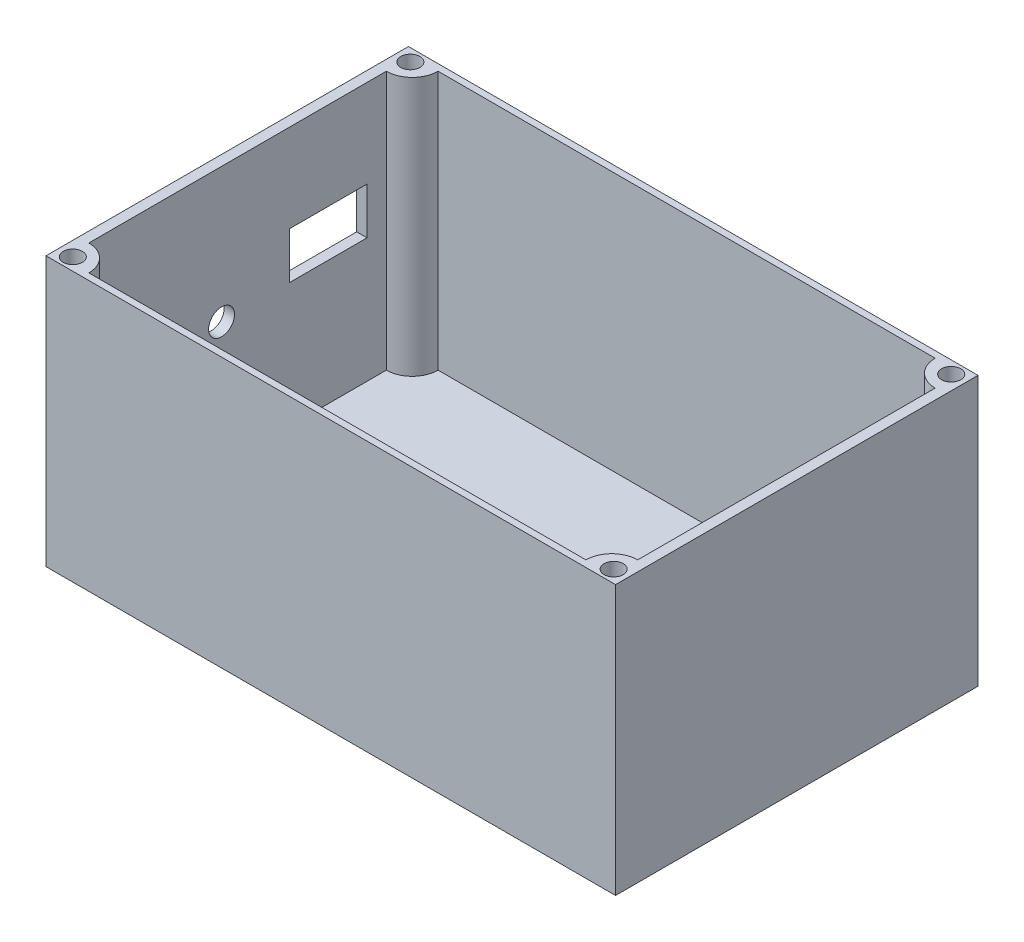
ISO-10303-21;
HEADER;
FILE_DESCRIPTION(('STEP AP214'),'2;1');
FILE_NAME('part.step','',(''),(''),'','','');
FILE_SCHEMA(('AUTOMOTIVE_DESIGN { 1 0 10303 214 1 1 1 1 }'));
ENDSEC;
DATA;
#1=APPLICATION_CONTEXT('core data for automotive mechanical design processes');
#2=APPLICATION_PROTOCOL_DEFINITION('international standard','automotive_design',2000,#1);
#3=PRODUCT_CONTEXT('',#1,'mechanical');
#4=PRODUCT('Part','Part','',(#3));
#5=PRODUCT_RELATED_PRODUCT_CATEGORY('part','',(#4));
#6=PRODUCT_DEFINITION_FORMATION('','',#4);
#7=PRODUCT_DEFINITION_CONTEXT('part definition',#1,'design');
#8=PRODUCT_DEFINITION('design','',#6,#7);
#9=PRODUCT_DEFINITION_SHAPE('','',#8);
#10=(LENGTH_UNIT() NAMED_UNIT(*) SI_UNIT(.MILLI.,.METRE.));
#11=(NAMED_UNIT(*) PLANE_ANGLE_UNIT() SI_UNIT($,.RADIAN.));
#12=(NAMED_UNIT(*) SI_UNIT($,.STERADIAN.) SOLID_ANGLE_UNIT());
#13=UNCERTAINTY_MEASURE_WITH_UNIT(LENGTH_MEASURE(1.E-05),#10,'distance_accuracy_value','');
#14=(GEOMETRIC_REPRESENTATION_CONTEXT(3) GLOBAL_UNCERTAINTY_ASSIGNED_CONTEXT((#13)) GLOBAL_UNIT_ASSIGNED_CONTEXT((#10,
#11,#12)) REPRESENTATION_CONTEXT('',''));
#15=CARTESIAN_POINT('',(0.,0.,0.));
#16=DIRECTION('',(0.,0.,1.));
#17=DIRECTION('',(1.,0.,0.));
#18=AXIS2_PLACEMENT_3D('',#15,#16,#17);
#19=CARTESIAN_POINT('',(55.,2.,35.));
#20=DIRECTION('',(-1.,0.,0.));
#21=DIRECTION('',(0.,0.,1.));
#22=AXIS2_PLACEMENT_3D('',#19,#20,#21);
#23=PLANE('',#22);
#24=DIRECTION('',(0.,0.,-1.));
#25=VECTOR('',#24,1.);
#26=CARTESIAN_POINT('',(55.,0.,35.));
#27=LINE('',#26,#25);
#28=CARTESIAN_POINT('',(55.,0.,35.));
#29=VERTEX_POINT('',#28);
#30=CARTESIAN_POINT('',(55.,0.,-35.));
#31=VERTEX_POINT('',#30);
#32=EDGE_CURVE('E251',#29,#31,#27,.T.);
#33=ORIENTED_EDGE('',*,*,#32,.T.);
#34=DIRECTION('',(0.,-1.,0.));
#35=VECTOR('',#34,1.);
#36=CARTESIAN_POINT('',(55.,2.,-35.));
#37=LINE('',#36,#35);
#38=CARTESIAN_POINT('',(55.,52.,-35.));
#39=VERTEX_POINT('',#38);
#40=EDGE_CURVE('E269',#39,#31,#37,.T.);
#41=ORIENTED_EDGE('',*,*,#40,.F.);
#42=DIRECTION('',(0.,0.,-1.));
#43=VECTOR('',#42,1.);
#44=CARTESIAN_POINT('',(55.,52.,35.));
#45=LINE('',#44,#43);
#46=CARTESIAN_POINT('',(55.,52.,35.));
#47=VERTEX_POINT('',#46);
#48=EDGE_CURVE('E239',#47,#39,#45,.T.);
#49=ORIENTED_EDGE('',*,*,#48,.F.);
#50=DIRECTION('',(0.,-1.,0.));
#51=VECTOR('',#50,1.);
#52=CARTESIAN_POINT('',(55.,2.,35.));
#53=LINE('',#52,#51);
#54=EDGE_CURVE('E260',#47,#29,#53,.T.);
#55=ORIENTED_EDGE('',*,*,#54,.T.);
#56=EDGE_LOOP('',(#33,#41,#49,#55));
#57=FACE_BOUND('',#56,.T.);
#58=ADVANCED_FACE('F33',(#57),#23,.F.);
#59=CARTESIAN_POINT('',(-55.,2.,-35.));
#60=DIRECTION('',(0.,0.,1.));
#61=DIRECTION('',(1.,0.,0.));
#62=AXIS2_PLACEMENT_3D('',#59,#60,#61);
#63=PLANE('',#62);
#64=DIRECTION('',(-1.,0.,0.));
#65=VECTOR('',#64,1.);
#66=CARTESIAN_POINT('',(-55.,0.,-35.));
#67=LINE('',#66,#65);
#68=CARTESIAN_POINT('',(-55.,0.,-35.));
#69=VERTEX_POINT('',#68);
#70=EDGE_CURVE('E254',#31,#69,#67,.T.);
#71=ORIENTED_EDGE('',*,*,#70,.T.);
#72=DIRECTION('',(0.,-1.,0.));
#73=VECTOR('',#72,1.);
#74=CARTESIAN_POINT('',(-55.,2.,-35.));
#75=LINE('',#74,#73);
#76=CARTESIAN_POINT('',(-55.,52.,-35.));
#77=VERTEX_POINT('',#76);
#78=EDGE_CURVE('E266',#77,#69,#75,.T.);
#79=ORIENTED_EDGE('',*,*,#78,.F.);
#80=DIRECTION('',(-1.,0.,0.));
#81=VECTOR('',#80,1.);
#82=CARTESIAN_POINT('',(-55.,52.,-35.));
#83=LINE('',#82,#81);
#84=EDGE_CURVE('E242',#39,#77,#83,.T.);
#85=ORIENTED_EDGE('',*,*,#84,.F.);
#86=ORIENTED_EDGE('',*,*,#40,.T.);
#87=EDGE_LOOP('',(#71,#79,#85,#86));
#88=FACE_BOUND('',#87,.T.);
#89=ADVANCED_FACE('F372',(#88),#63,.F.);
#90=CARTESIAN_POINT('',(-55.,2.,35.));
#91=DIRECTION('',(1.,0.,0.));
#92=DIRECTION('',(0.,0.,-1.));
#93=AXIS2_PLACEMENT_3D('',#90,#91,#92);
#94=PLANE('',#93);
#95=DIRECTION('',(0.,1.,0.));
#96=VECTOR('',#95,1.);
#97=CARTESIAN_POINT('',(-55.,35.,-10.));
#98=LINE('',#97,#96);
#99=CARTESIAN_POINT('',(-55.,26.,-10.));
#100=VERTEX_POINT('',#99);
#101=CARTESIAN_POINT('',(-55.,35.,-10.));
#102=VERTEX_POINT('',#101);
#103=EDGE_CURVE('E156',#100,#102,#98,.T.);
#104=ORIENTED_EDGE('',*,*,#103,.F.);
#105=DIRECTION('',(0.,0.,1.));
#106=VECTOR('',#105,1.);
#107=CARTESIAN_POINT('',(-55.,26.,-10.));
#108=LINE('',#107,#106);
#109=CARTESIAN_POINT('',(-55.,26.,-25.));
#110=VERTEX_POINT('',#109);
#111=EDGE_CURVE('E47',#110,#100,#108,.T.);
#112=ORIENTED_EDGE('',*,*,#111,.F.);
#113=DIRECTION('',(0.,-1.,0.));
#114=VECTOR('',#113,1.);
#115=CARTESIAN_POINT('',(-55.,26.,-25.));
#116=LINE('',#115,#114);
#117=CARTESIAN_POINT('',(-55.,35.,-25.));
#118=VERTEX_POINT('',#117);
#119=EDGE_CURVE('E163',#118,#110,#116,.T.);
#120=ORIENTED_EDGE('',*,*,#119,.F.);
#121=DIRECTION('',(0.,0.,-1.));
#122=VECTOR('',#121,1.);
#123=CARTESIAN_POINT('',(-55.,35.,-25.));
#124=LINE('',#123,#122);
#125=EDGE_CURVE('E147',#102,#118,#124,.T.);
#126=ORIENTED_EDGE('',*,*,#125,.F.);
#127=EDGE_LOOP('',(#104,#112,#120,#126));
#128=FACE_BOUND('',#127,.T.);
#129=CARTESIAN_POINT('',(-55.,26.,3.09429284759305));
#130=DIRECTION('',(-1.,0.,0.));
#131=DIRECTION('',(0.,0.,1.));
#132=AXIS2_PLACEMENT_3D('',#129,#130,#131);
#133=CIRCLE('',#132,2.5);
#134=CARTESIAN_POINT('',(-55.,26.,5.59429284759306));
#135=VERTEX_POINT('',#134);
#136=EDGE_CURVE('E173',#135,#135,#133,.T.);
#137=ORIENTED_EDGE('',*,*,#136,.F.);
#138=EDGE_LOOP('',(#137));
#139=FACE_BOUND('',#138,.T.);
#140=CARTESIAN_POINT('',(-55.,26.,21.6885856951861));
#141=DIRECTION('',(-1.,0.,0.));
#142=DIRECTION('',(0.,0.,1.));
#143=AXIS2_PLACEMENT_3D('',#140,#141,#142);
#144=CIRCLE('',#143,5.5);
#145=CARTESIAN_POINT('',(-55.,26.,27.1885856951861));
#146=VERTEX_POINT('',#145);
#147=EDGE_CURVE('E177',#146,#146,#144,.T.);
#148=ORIENTED_EDGE('',*,*,#147,.F.);
#149=EDGE_LOOP('',(#148));
#150=FACE_BOUND('',#149,.T.);
#151=DIRECTION('',(0.,0.,1.));
#152=VECTOR('',#151,1.);
#153=CARTESIAN_POINT('',(-55.,0.,35.));
#154=LINE('',#153,#152);
#155=CARTESIAN_POINT('',(-55.,0.,35.));
#156=VERTEX_POINT('',#155);
#157=EDGE_CURVE('E256',#69,#156,#154,.T.);
#158=ORIENTED_EDGE('',*,*,#157,.T.);
#159=DIRECTION('',(0.,-1.,0.));
#160=VECTOR('',#159,1.);
#161=CARTESIAN_POINT('',(-55.,2.,35.));
#162=LINE('',#161,#160);
#163=CARTESIAN_POINT('',(-55.,52.,35.));
#164=VERTEX_POINT('',#163);
#165=EDGE_CURVE('E263',#164,#156,#162,.T.);
#166=ORIENTED_EDGE('',*,*,#165,.F.);
#167=DIRECTION('',(0.,0.,1.));
#168=VECTOR('',#167,1.);
#169=CARTESIAN_POINT('',(-55.,52.,35.));
#170=LINE('',#169,#168);
#171=EDGE_CURVE('E245',#77,#164,#170,.T.);
#172=ORIENTED_EDGE('',*,*,#171,.F.);
#173=ORIENTED_EDGE('',*,*,#78,.T.);
#174=EDGE_LOOP('',(#158,#166,#172,#173));
#175=FACE_BOUND('',#174,.T.);
#176=ADVANCED_FACE('F160',(#128,#139,#150,#175),#94,.F.);
#177=CARTESIAN_POINT('',(-55.,2.,35.));
#178=DIRECTION('',(0.,0.,-1.));
#179=DIRECTION('',(-1.,0.,0.));
#180=AXIS2_PLACEMENT_3D('',#177,#178,#179);
#181=PLANE('',#180);
#182=DIRECTION('',(1.,0.,0.));
#183=VECTOR('',#182,1.);
#184=CARTESIAN_POINT('',(-55.,0.,35.));
#185=LINE('',#184,#183);
#186=EDGE_CURVE('E258',#156,#29,#185,.T.);
#187=ORIENTED_EDGE('',*,*,#186,.T.);
#188=ORIENTED_EDGE('',*,*,#54,.F.);
#189=DIRECTION('',(1.,0.,0.));
#190=VECTOR('',#189,1.);
#191=CARTESIAN_POINT('',(-55.,52.,35.));
#192=LINE('',#191,#190);
#193=EDGE_CURVE('E248',#164,#47,#192,.T.);
#194=ORIENTED_EDGE('',*,*,#193,.F.);
#195=ORIENTED_EDGE('',*,*,#165,.T.);
#196=EDGE_LOOP('',(#187,#188,#194,#195));
#197=FACE_BOUND('',#196,.T.);
#198=ADVANCED_FACE('F387',(#197),#181,.F.);
#199=CARTESIAN_POINT('',(0.,0.,0.));
#200=DIRECTION('',(0.,-1.,0.));
#201=DIRECTION('',(0.,0.,-1.));
#202=AXIS2_PLACEMENT_3D('',#199,#200,#201);
#203=PLANE('',#202);
#204=CARTESIAN_POINT('',(-52.2322330470336,0.,32.59586941067));
#205=DIRECTION('',(0.,-1.,0.));
#206=DIRECTION('',(0.,0.,-1.));
#207=AXIS2_PLACEMENT_3D('',#204,#205,#206);
#208=CIRCLE('',#207,1.85000000000001);
#209=CARTESIAN_POINT('',(-52.2322330470336,0.,30.74586941067));
#210=VERTEX_POINT('',#209);
#211=EDGE_CURVE('E176',#210,#210,#208,.T.);
#212=ORIENTED_EDGE('',*,*,#211,.F.);
#213=EDGE_LOOP('',(#212));
#214=FACE_BOUND('',#213,.T.);
#215=CARTESIAN_POINT('',(52.2322330470336,0.,32.59586941067));
#216=DIRECTION('',(0.,-1.,0.));
#217=DIRECTION('',(0.,0.,-1.));
#218=AXIS2_PLACEMENT_3D('',#215,#216,#217);
#219=CIRCLE('',#218,1.85);
#220=CARTESIAN_POINT('',(52.2322330470336,0.,30.74586941067));
#221=VERTEX_POINT('',#220);
#222=EDGE_CURVE('E290',#221,#221,#219,.T.);
#223=ORIENTED_EDGE('',*,*,#222,.F.);
#224=EDGE_LOOP('',(#223));
#225=FACE_BOUND('',#224,.T.);
#226=CARTESIAN_POINT('',(52.2322330470336,0.,-32.59586941067));
#227=DIRECTION('',(0.,-1.,0.));
#228=DIRECTION('',(0.,0.,-1.));
#229=AXIS2_PLACEMENT_3D('',#226,#227,#228);
#230=CIRCLE('',#229,1.85);
#231=CARTESIAN_POINT('',(52.2322330470336,0.,-34.44586941067));
#232=VERTEX_POINT('',#231);
#233=EDGE_CURVE('E293',#232,#232,#230,.T.);
#234=ORIENTED_EDGE('',*,*,#233,.F.);
#235=EDGE_LOOP('',(#234));
#236=FACE_BOUND('',#235,.T.);
#237=CARTESIAN_POINT('',(-52.2322330470336,0.,-32.59586941067));
#238=DIRECTION('',(0.,-1.,0.));
#239=DIRECTION('',(0.,0.,-1.));
#240=AXIS2_PLACEMENT_3D('',#237,#238,#239);
#241=CIRCLE('',#240,1.85);
#242=CARTESIAN_POINT('',(-52.2322330470336,0.,-34.44586941067));
#243=VERTEX_POINT('',#242);
#244=EDGE_CURVE('E296',#243,#243,#241,.T.);
#245=ORIENTED_EDGE('',*,*,#244,.F.);
#246=EDGE_LOOP('',(#245));
#247=FACE_BOUND('',#246,.T.);
#248=ORIENTED_EDGE('',*,*,#32,.F.);
#249=ORIENTED_EDGE('',*,*,#186,.F.);
#250=ORIENTED_EDGE('',*,*,#157,.F.);
#251=ORIENTED_EDGE('',*,*,#70,.F.);
#252=EDGE_LOOP('',(#248,#249,#250,#251));
#253=FACE_BOUND('',#252,.T.);
#254=ADVANCED_FACE('F318',(#214,#225,#236,#247,#253),#203,.T.);
#255=CARTESIAN_POINT('',(0.,52.,0.));
#256=DIRECTION('',(0.,-1.,0.));
#257=DIRECTION('',(0.,0.,-1.));
#258=AXIS2_PLACEMENT_3D('',#255,#256,#257);
#259=PLANE('',#258);
#260=CARTESIAN_POINT('',(-52.2322330470336,52.,32.59586941067));
#261=DIRECTION('',(0.,1.,0.));
#262=DIRECTION('',(0.,0.,1.));
#263=AXIS2_PLACEMENT_3D('',#260,#261,#262);
#264=CIRCLE('',#263,1.85000000000001);
#265=CARTESIAN_POINT('',(-52.2322330470336,52.,34.44586941067));
#266=VERTEX_POINT('',#265);
#267=EDGE_CURVE('E303',#266,#266,#264,.T.);
#268=ORIENTED_EDGE('',*,*,#267,.F.);
#269=EDGE_LOOP('',(#268));
#270=FACE_BOUND('',#269,.T.);
#271=CARTESIAN_POINT('',(52.2322330470336,52.,32.59586941067));
#272=DIRECTION('',(0.,1.,0.));
#273=DIRECTION('',(0.,0.,1.));
#274=AXIS2_PLACEMENT_3D('',#271,#272,#273);
#275=CIRCLE('',#274,1.85);
#276=CARTESIAN_POINT('',(52.2322330470336,52.,34.44586941067));
#277=VERTEX_POINT('',#276);
#278=EDGE_CURVE('E306',#277,#277,#275,.T.);
#279=ORIENTED_EDGE('',*,*,#278,.F.);
#280=EDGE_LOOP('',(#279));
#281=FACE_BOUND('',#280,.T.);
#282=CARTESIAN_POINT('',(52.2322330470336,52.,-32.59586941067));
#283=DIRECTION('',(0.,1.,0.));
#284=DIRECTION('',(0.,0.,1.));
#285=AXIS2_PLACEMENT_3D('',#282,#283,#284);
#286=CIRCLE('',#285,1.85);
#287=CARTESIAN_POINT('',(52.2322330470336,52.,-30.74586941067));
#288=VERTEX_POINT('',#287);
#289=EDGE_CURVE('E302',#288,#288,#286,.T.);
#290=ORIENTED_EDGE('',*,*,#289,.F.);
#291=EDGE_LOOP('',(#290));
#292=FACE_BOUND('',#291,.T.);
#293=CARTESIAN_POINT('',(-52.2322330470336,52.,-32.59586941067));
#294=DIRECTION('',(0.,1.,0.));
#295=DIRECTION('',(0.,0.,1.));
#296=AXIS2_PLACEMENT_3D('',#293,#294,#295);
#297=CIRCLE('',#296,1.85);
#298=CARTESIAN_POINT('',(-52.2322330470336,52.,-30.74586941067));
#299=VERTEX_POINT('',#298);
#300=EDGE_CURVE('E299',#299,#299,#297,.T.);
#301=ORIENTED_EDGE('',*,*,#300,.F.);
#302=EDGE_LOOP('',(#301));
#303=FACE_BOUND('',#302,.T.);
#304=ORIENTED_EDGE('',*,*,#48,.T.);
#305=ORIENTED_EDGE('',*,*,#84,.T.);
#306=ORIENTED_EDGE('',*,*,#171,.T.);
#307=ORIENTED_EDGE('',*,*,#193,.T.);
#308=EDGE_LOOP('',(#304,#305,#306,#307));
#309=FACE_BOUND('',#308,.T.);
#310=CARTESIAN_POINT('',(-53.,52.,-33.7272727272727));
#311=DIRECTION('',(0.,-1.,0.));
#312=DIRECTION('',(0.,0.,1.));
#313=AXIS2_PLACEMENT_3D('',#310,#311,#312);
#314=CIRCLE('',#313,5.);
#315=CARTESIAN_POINT('',(-48.,52.,-33.7272727272728));
#316=VERTEX_POINT('',#315);
#317=CARTESIAN_POINT('',(-53.,52.,-28.7272727272727));
#318=VERTEX_POINT('',#317);
#319=EDGE_CURVE('E181',#316,#318,#314,.T.);
#320=ORIENTED_EDGE('',*,*,#319,.F.);
#321=DIRECTION('',(-1.,0.,0.));
#322=VECTOR('',#321,1.);
#323=CARTESIAN_POINT('',(-48.,52.,-33.7272727272728));
#324=LINE('',#323,#322);
#325=CARTESIAN_POINT('',(48.,52.,-33.7272727272727));
#326=VERTEX_POINT('',#325);
#327=EDGE_CURVE('E197',#326,#316,#324,.T.);
#328=ORIENTED_EDGE('',*,*,#327,.F.);
#329=CARTESIAN_POINT('',(53.,52.,-33.7272727272727));
#330=DIRECTION('',(0.,-1.,0.));
#331=DIRECTION('',(0.,0.,1.));
#332=AXIS2_PLACEMENT_3D('',#329,#330,#331);
#333=CIRCLE('',#332,5.);
#334=CARTESIAN_POINT('',(53.,52.,-28.7272727272727));
#335=VERTEX_POINT('',#334);
#336=EDGE_CURVE('E194',#335,#326,#333,.T.);
#337=ORIENTED_EDGE('',*,*,#336,.F.);
#338=DIRECTION('',(0.,0.,-1.));
#339=VECTOR('',#338,1.);
#340=CARTESIAN_POINT('',(53.,52.,28.7272727272727));
#341=LINE('',#340,#339);
#342=CARTESIAN_POINT('',(53.,52.,28.7272727272727));
#343=VERTEX_POINT('',#342);
#344=EDGE_CURVE('E192',#343,#335,#341,.T.);
#345=ORIENTED_EDGE('',*,*,#344,.F.);
#346=CARTESIAN_POINT('',(53.,52.,33.7272727272727));
#347=DIRECTION('',(0.,-1.,0.));
#348=DIRECTION('',(0.,0.,1.));
#349=AXIS2_PLACEMENT_3D('',#346,#347,#348);
#350=CIRCLE('',#349,5.);
#351=CARTESIAN_POINT('',(48.,52.,33.7272727272727));
#352=VERTEX_POINT('',#351);
#353=EDGE_CURVE('E190',#352,#343,#350,.T.);
#354=ORIENTED_EDGE('',*,*,#353,.F.);
#355=DIRECTION('',(1.,0.,0.));
#356=VECTOR('',#355,1.);
#357=CARTESIAN_POINT('',(-48.,52.,33.7272727272727));
#358=LINE('',#357,#356);
#359=CARTESIAN_POINT('',(-48.,52.,33.7272727272727));
#360=VERTEX_POINT('',#359);
#361=EDGE_CURVE('E188',#360,#352,#358,.T.);
#362=ORIENTED_EDGE('',*,*,#361,.F.);
#363=CARTESIAN_POINT('',(-53.,52.,33.7272727272727));
#364=DIRECTION('',(0.,-1.,0.));
#365=DIRECTION('',(0.,0.,1.));
#366=AXIS2_PLACEMENT_3D('',#363,#364,#365);
#367=CIRCLE('',#366,5.);
#368=CARTESIAN_POINT('',(-53.,52.,28.7272727272727));
#369=VERTEX_POINT('',#368);
#370=EDGE_CURVE('E186',#369,#360,#367,.T.);
#371=ORIENTED_EDGE('',*,*,#370,.F.);
#372=DIRECTION('',(0.,0.,1.));
#373=VECTOR('',#372,1.);
#374=CARTESIAN_POINT('',(-53.,52.,28.7272727272727));
#375=LINE('',#374,#373);
#376=EDGE_CURVE('E183',#318,#369,#375,.T.);
#377=ORIENTED_EDGE('',*,*,#376,.F.);
#378=EDGE_LOOP('',(#320,#328,#337,#345,#354,#362,#371,#377));
#379=FACE_BOUND('',#378,.T.);
#380=ADVANCED_FACE('F314',(#270,#281,#292,#303,#309,#379),#259,.F.);
#381=CARTESIAN_POINT('',(-53.,52.,-33.7272727272727));
#382=DIRECTION('',(0.,-1.,0.));
#383=DIRECTION('',(0.,0.,-1.));
#384=AXIS2_PLACEMENT_3D('',#381,#382,#383);
#385=CYLINDRICAL_SURFACE('',#384,5.);
#386=CARTESIAN_POINT('',(-53.,2.,-33.7272727272727));
#387=DIRECTION('',(0.,-1.,0.));
#388=DIRECTION('',(0.,0.,1.));
#389=AXIS2_PLACEMENT_3D('',#386,#387,#388);
#390=CIRCLE('',#389,5.);
#391=CARTESIAN_POINT('',(-48.,2.,-33.7272727272728));
#392=VERTEX_POINT('',#391);
#393=CARTESIAN_POINT('',(-53.,2.,-28.7272727272727));
#394=VERTEX_POINT('',#393);
#395=EDGE_CURVE('E200',#392,#394,#390,.T.);
#396=ORIENTED_EDGE('',*,*,#395,.F.);
#397=DIRECTION('',(0.,-1.,0.));
#398=VECTOR('',#397,1.);
#399=CARTESIAN_POINT('',(-48.,52.,-33.7272727272728));
#400=LINE('',#399,#398);
#401=EDGE_CURVE('E199',#316,#392,#400,.T.);
#402=ORIENTED_EDGE('',*,*,#401,.F.);
#403=ORIENTED_EDGE('',*,*,#319,.T.);
#404=DIRECTION('',(0.,-1.,0.));
#405=VECTOR('',#404,1.);
#406=CARTESIAN_POINT('',(-53.,52.,-28.7272727272727));
#407=LINE('',#406,#405);
#408=EDGE_CURVE('E236',#318,#394,#407,.T.);
#409=ORIENTED_EDGE('',*,*,#408,.T.);
#410=EDGE_LOOP('',(#396,#402,#403,#409));
#411=FACE_BOUND('',#410,.T.);
#412=ADVANCED_FACE('F317',(#411),#385,.T.);
#413=CARTESIAN_POINT('',(-53.,52.,28.7272727272727));
#414=DIRECTION('',(1.,0.,0.));
#415=DIRECTION('',(0.,0.,-1.));
#416=AXIS2_PLACEMENT_3D('',#413,#414,#415);
#417=PLANE('',#416);
#418=DIRECTION('',(0.,0.,-1.));
#419=VECTOR('',#418,1.);
#420=CARTESIAN_POINT('',(-53.,26.,28.7272727272727));
#421=LINE('',#420,#419);
#422=CARTESIAN_POINT('',(-53.,26.,-10.));
#423=VERTEX_POINT('',#422);
#424=CARTESIAN_POINT('',(-53.,26.,-25.));
#425=VERTEX_POINT('',#424);
#426=EDGE_CURVE('E11',#423,#425,#421,.T.);
#427=ORIENTED_EDGE('',*,*,#426,.F.);
#428=DIRECTION('',(0.,-1.,0.));
#429=VECTOR('',#428,1.);
#430=CARTESIAN_POINT('',(-53.,52.,-10.));
#431=LINE('',#430,#429);
#432=CARTESIAN_POINT('',(-53.,35.,-10.));
#433=VERTEX_POINT('',#432);
#434=EDGE_CURVE('E272',#433,#423,#431,.T.);
#435=ORIENTED_EDGE('',*,*,#434,.F.);
#436=DIRECTION('',(0.,0.,1.));
#437=VECTOR('',#436,1.);
#438=CARTESIAN_POINT('',(-53.,35.,28.7272727272727));
#439=LINE('',#438,#437);
#440=CARTESIAN_POINT('',(-53.,35.,-25.));
#441=VERTEX_POINT('',#440);
#442=EDGE_CURVE('E150',#441,#433,#439,.T.);
#443=ORIENTED_EDGE('',*,*,#442,.F.);
#444=DIRECTION('',(0.,1.,0.));
#445=VECTOR('',#444,1.);
#446=CARTESIAN_POINT('',(-53.,52.,-25.));
#447=LINE('',#446,#445);
#448=EDGE_CURVE('E40',#425,#441,#447,.T.);
#449=ORIENTED_EDGE('',*,*,#448,.F.);
#450=EDGE_LOOP('',(#427,#435,#443,#449));
#451=FACE_BOUND('',#450,.T.);
#452=CARTESIAN_POINT('',(-53.,26.,3.09429284759305));
#453=DIRECTION('',(1.,0.,0.));
#454=DIRECTION('',(0.,0.,-1.));
#455=AXIS2_PLACEMENT_3D('',#452,#453,#454);
#456=CIRCLE('',#455,2.5);
#457=CARTESIAN_POINT('',(-53.,26.,0.594292847593051));
#458=VERTEX_POINT('',#457);
#459=EDGE_CURVE('E170',#458,#458,#456,.T.);
#460=ORIENTED_EDGE('',*,*,#459,.F.);
#461=EDGE_LOOP('',(#460));
#462=FACE_BOUND('',#461,.T.);
#463=CARTESIAN_POINT('',(-53.,26.,21.6885856951861));
#464=DIRECTION('',(1.,0.,0.));
#465=DIRECTION('',(0.,0.,-1.));
#466=AXIS2_PLACEMENT_3D('',#463,#464,#465);
#467=CIRCLE('',#466,5.5);
#468=CARTESIAN_POINT('',(-53.,26.,16.1885856951861));
#469=VERTEX_POINT('',#468);
#470=EDGE_CURVE('E180',#469,#469,#467,.T.);
#471=ORIENTED_EDGE('',*,*,#470,.F.);
#472=EDGE_LOOP('',(#471));
#473=FACE_BOUND('',#472,.T.);
#474=DIRECTION('',(0.,0.,1.));
#475=VECTOR('',#474,1.);
#476=CARTESIAN_POINT('',(-53.,2.,28.7272727272727));
#477=LINE('',#476,#475);
#478=CARTESIAN_POINT('',(-53.,2.,28.7272727272727));
#479=VERTEX_POINT('',#478);
#480=EDGE_CURVE('E203',#394,#479,#477,.T.);
#481=ORIENTED_EDGE('',*,*,#480,.F.);
#482=ORIENTED_EDGE('',*,*,#408,.F.);
#483=ORIENTED_EDGE('',*,*,#376,.T.);
#484=DIRECTION('',(0.,-1.,0.));
#485=VECTOR('',#484,1.);
#486=CARTESIAN_POINT('',(-53.,52.,28.7272727272727));
#487=LINE('',#486,#485);
#488=EDGE_CURVE('E234',#369,#479,#487,.T.);
#489=ORIENTED_EDGE('',*,*,#488,.T.);
#490=EDGE_LOOP('',(#481,#482,#483,#489));
#491=FACE_BOUND('',#490,.T.);
#492=ADVANCED_FACE('F284',(#451,#462,#473,#491),#417,.T.);
#493=CARTESIAN_POINT('',(-53.,52.,33.7272727272727));
#494=DIRECTION('',(0.,-1.,0.));
#495=DIRECTION('',(0.,0.,-1.));
#496=AXIS2_PLACEMENT_3D('',#493,#494,#495);
#497=CYLINDRICAL_SURFACE('',#496,5.);
#498=CARTESIAN_POINT('',(-53.,2.,33.7272727272727));
#499=DIRECTION('',(0.,-1.,0.));
#500=DIRECTION('',(0.,0.,1.));
#501=AXIS2_PLACEMENT_3D('',#498,#499,#500);
#502=CIRCLE('',#501,5.);
#503=CARTESIAN_POINT('',(-48.,2.,33.7272727272727));
#504=VERTEX_POINT('',#503);
#505=EDGE_CURVE('E206',#479,#504,#502,.T.);
#506=ORIENTED_EDGE('',*,*,#505,.F.);
#507=ORIENTED_EDGE('',*,*,#488,.F.);
#508=ORIENTED_EDGE('',*,*,#370,.T.);
#509=DIRECTION('',(0.,-1.,0.));
#510=VECTOR('',#509,1.);
#511=CARTESIAN_POINT('',(-48.,52.,33.7272727272727));
#512=LINE('',#511,#510);
#513=EDGE_CURVE('E232',#360,#504,#512,.T.);
#514=ORIENTED_EDGE('',*,*,#513,.T.);
#515=EDGE_LOOP('',(#506,#507,#508,#514));
#516=FACE_BOUND('',#515,.T.);
#517=ADVANCED_FACE('F362',(#516),#497,.T.);
#518=CARTESIAN_POINT('',(-48.,52.,33.7272727272727));
#519=DIRECTION('',(0.,0.,-1.));
#520=DIRECTION('',(-1.,0.,0.));
#521=AXIS2_PLACEMENT_3D('',#518,#519,#520);
#522=PLANE('',#521);
#523=DIRECTION('',(1.,0.,0.));
#524=VECTOR('',#523,1.);
#525=CARTESIAN_POINT('',(-48.,2.,33.7272727272727));
#526=LINE('',#525,#524);
#527=CARTESIAN_POINT('',(48.,2.,33.7272727272727));
#528=VERTEX_POINT('',#527);
#529=EDGE_CURVE('E209',#504,#528,#526,.T.);
#530=ORIENTED_EDGE('',*,*,#529,.F.);
#531=ORIENTED_EDGE('',*,*,#513,.F.);
#532=ORIENTED_EDGE('',*,*,#361,.T.);
#533=DIRECTION('',(0.,-1.,0.));
#534=VECTOR('',#533,1.);
#535=CARTESIAN_POINT('',(48.,52.,33.7272727272727));
#536=LINE('',#535,#534);
#537=EDGE_CURVE('E230',#352,#528,#536,.T.);
#538=ORIENTED_EDGE('',*,*,#537,.T.);
#539=EDGE_LOOP('',(#530,#531,#532,#538));
#540=FACE_BOUND('',#539,.T.);
#541=ADVANCED_FACE('F359',(#540),#522,.T.);
#542=CARTESIAN_POINT('',(53.,52.,33.7272727272727));
#543=DIRECTION('',(0.,-1.,0.));
#544=DIRECTION('',(0.,0.,-1.));
#545=AXIS2_PLACEMENT_3D('',#542,#543,#544);
#546=CYLINDRICAL_SURFACE('',#545,5.);
#547=CARTESIAN_POINT('',(53.,2.,33.7272727272727));
#548=DIRECTION('',(0.,-1.,0.));
#549=DIRECTION('',(0.,0.,1.));
#550=AXIS2_PLACEMENT_3D('',#547,#548,#549);
#551=CIRCLE('',#550,5.);
#552=CARTESIAN_POINT('',(53.,2.,28.7272727272727));
#553=VERTEX_POINT('',#552);
#554=EDGE_CURVE('E212',#528,#553,#551,.T.);
#555=ORIENTED_EDGE('',*,*,#554,.F.);
#556=ORIENTED_EDGE('',*,*,#537,.F.);
#557=ORIENTED_EDGE('',*,*,#353,.T.);
#558=DIRECTION('',(0.,-1.,0.));
#559=VECTOR('',#558,1.);
#560=CARTESIAN_POINT('',(53.,52.,28.7272727272727));
#561=LINE('',#560,#559);
#562=EDGE_CURVE('E228',#343,#553,#561,.T.);
#563=ORIENTED_EDGE('',*,*,#562,.T.);
#564=EDGE_LOOP('',(#555,#556,#557,#563));
#565=FACE_BOUND('',#564,.T.);
#566=ADVANCED_FACE('F355',(#565),#546,.T.);
#567=CARTESIAN_POINT('',(53.,52.,28.7272727272727));
#568=DIRECTION('',(-1.,0.,0.));
#569=DIRECTION('',(0.,0.,1.));
#570=AXIS2_PLACEMENT_3D('',#567,#568,#569);
#571=PLANE('',#570);
#572=DIRECTION('',(0.,0.,-1.));
#573=VECTOR('',#572,1.);
#574=CARTESIAN_POINT('',(53.,2.,28.7272727272727));
#575=LINE('',#574,#573);
#576=CARTESIAN_POINT('',(53.,2.,-28.7272727272727));
#577=VERTEX_POINT('',#576);
#578=EDGE_CURVE('E215',#553,#577,#575,.T.);
#579=ORIENTED_EDGE('',*,*,#578,.F.);
#580=ORIENTED_EDGE('',*,*,#562,.F.);
#581=ORIENTED_EDGE('',*,*,#344,.T.);
#582=DIRECTION('',(0.,-1.,0.));
#583=VECTOR('',#582,1.);
#584=CARTESIAN_POINT('',(53.,52.,-28.7272727272727));
#585=LINE('',#584,#583);
#586=EDGE_CURVE('E226',#335,#577,#585,.T.);
#587=ORIENTED_EDGE('',*,*,#586,.T.);
#588=EDGE_LOOP('',(#579,#580,#581,#587));
#589=FACE_BOUND('',#588,.T.);
#590=ADVANCED_FACE('F352',(#589),#571,.T.);
#591=CARTESIAN_POINT('',(53.,52.,-33.7272727272727));
#592=DIRECTION('',(0.,-1.,0.));
#593=DIRECTION('',(0.,0.,-1.));
#594=AXIS2_PLACEMENT_3D('',#591,#592,#593);
#595=CYLINDRICAL_SURFACE('',#594,5.);
#596=CARTESIAN_POINT('',(53.,2.,-33.7272727272727));
#597=DIRECTION('',(0.,-1.,0.));
#598=DIRECTION('',(0.,0.,1.));
#599=AXIS2_PLACEMENT_3D('',#596,#597,#598);
#600=CIRCLE('',#599,5.);
#601=CARTESIAN_POINT('',(48.,2.,-33.7272727272727));
#602=VERTEX_POINT('',#601);
#603=EDGE_CURVE('E218',#577,#602,#600,.T.);
#604=ORIENTED_EDGE('',*,*,#603,.F.);
#605=ORIENTED_EDGE('',*,*,#586,.F.);
#606=ORIENTED_EDGE('',*,*,#336,.T.);
#607=DIRECTION('',(0.,-1.,0.));
#608=VECTOR('',#607,1.);
#609=CARTESIAN_POINT('',(48.,52.,-33.7272727272727));
#610=LINE('',#609,#608);
#611=EDGE_CURVE('E224',#326,#602,#610,.T.);
#612=ORIENTED_EDGE('',*,*,#611,.T.);
#613=EDGE_LOOP('',(#604,#605,#606,#612));
#614=FACE_BOUND('',#613,.T.);
#615=ADVANCED_FACE('F345',(#614),#595,.T.);
#616=CARTESIAN_POINT('',(-48.,52.,-33.7272727272728));
#617=DIRECTION('',(0.,0.,1.));
#618=DIRECTION('',(1.,0.,0.));
#619=AXIS2_PLACEMENT_3D('',#616,#617,#618);
#620=PLANE('',#619);
#621=DIRECTION('',(-1.,0.,0.));
#622=VECTOR('',#621,1.);
#623=CARTESIAN_POINT('',(-48.,2.,-33.7272727272728));
#624=LINE('',#623,#622);
#625=EDGE_CURVE('E184',#602,#392,#624,.T.);
#626=ORIENTED_EDGE('',*,*,#625,.F.);
#627=ORIENTED_EDGE('',*,*,#611,.F.);
#628=ORIENTED_EDGE('',*,*,#327,.T.);
#629=ORIENTED_EDGE('',*,*,#401,.T.);
#630=EDGE_LOOP('',(#626,#627,#628,#629));
#631=FACE_BOUND('',#630,.T.);
#632=ADVANCED_FACE('F342',(#631),#620,.T.);
#633=CARTESIAN_POINT('',(0.,2.,0.));
#634=DIRECTION('',(0.,-1.,0.));
#635=DIRECTION('',(0.,0.,-1.));
#636=AXIS2_PLACEMENT_3D('',#633,#634,#635);
#637=PLANE('',#636);
#638=ORIENTED_EDGE('',*,*,#625,.T.);
#639=ORIENTED_EDGE('',*,*,#395,.T.);
#640=ORIENTED_EDGE('',*,*,#480,.T.);
#641=ORIENTED_EDGE('',*,*,#505,.T.);
#642=ORIENTED_EDGE('',*,*,#529,.T.);
#643=ORIENTED_EDGE('',*,*,#554,.T.);
#644=ORIENTED_EDGE('',*,*,#578,.T.);
#645=ORIENTED_EDGE('',*,*,#603,.T.);
#646=EDGE_LOOP('',(#638,#639,#640,#641,#642,#643,#644,#645));
#647=FACE_BOUND('',#646,.T.);
#648=ADVANCED_FACE('F338',(#647),#637,.F.);
#649=CARTESIAN_POINT('',(-42.,26.,21.6885856951861));
#650=DIRECTION('',(-1.,0.,0.));
#651=DIRECTION('',(0.,0.,1.));
#652=AXIS2_PLACEMENT_3D('',#649,#650,#651);
#653=CYLINDRICAL_SURFACE('',#652,5.5);
#654=ORIENTED_EDGE('',*,*,#470,.T.);
#655=EDGE_LOOP('',(#654));
#656=FACE_BOUND('',#655,.T.);
#657=ORIENTED_EDGE('',*,*,#147,.T.);
#658=EDGE_LOOP('',(#657));
#659=FACE_BOUND('',#658,.T.);
#660=ADVANCED_FACE('F399',(#656,#659),#653,.F.);
#661=CARTESIAN_POINT('',(-42.,26.,3.09429284759305));
#662=DIRECTION('',(-1.,0.,0.));
#663=DIRECTION('',(0.,0.,1.));
#664=AXIS2_PLACEMENT_3D('',#661,#662,#663);
#665=CYLINDRICAL_SURFACE('',#664,2.5);
#666=ORIENTED_EDGE('',*,*,#459,.T.);
#667=EDGE_LOOP('',(#666));
#668=FACE_BOUND('',#667,.T.);
#669=ORIENTED_EDGE('',*,*,#136,.T.);
#670=EDGE_LOOP('',(#669));
#671=FACE_BOUND('',#670,.T.);
#672=ADVANCED_FACE('F420',(#668,#671),#665,.F.);
#673=CARTESIAN_POINT('',(-42.,26.,-10.));
#674=DIRECTION('',(0.,-1.,0.));
#675=DIRECTION('',(0.,0.,-1.));
#676=AXIS2_PLACEMENT_3D('',#673,#674,#675);
#677=PLANE('',#676);
#678=ORIENTED_EDGE('',*,*,#426,.T.);
#679=DIRECTION('',(-1.,0.,0.));
#680=VECTOR('',#679,1.);
#681=CARTESIAN_POINT('',(-42.,26.,-25.));
#682=LINE('',#681,#680);
#683=EDGE_CURVE('E168',#425,#110,#682,.T.);
#684=ORIENTED_EDGE('',*,*,#683,.T.);
#685=ORIENTED_EDGE('',*,*,#111,.T.);
#686=DIRECTION('',(-1.,0.,0.));
#687=VECTOR('',#686,1.);
#688=CARTESIAN_POINT('',(-42.,26.,-10.));
#689=LINE('',#688,#687);
#690=EDGE_CURVE('E153',#423,#100,#689,.T.);
#691=ORIENTED_EDGE('',*,*,#690,.F.);
#692=EDGE_LOOP('',(#678,#684,#685,#691));
#693=FACE_BOUND('',#692,.T.);
#694=ADVANCED_FACE('F286',(#693),#677,.F.);
#695=CARTESIAN_POINT('',(-42.,26.,-25.));
#696=DIRECTION('',(0.,0.,-1.));
#697=DIRECTION('',(-1.,0.,0.));
#698=AXIS2_PLACEMENT_3D('',#695,#696,#697);
#699=PLANE('',#698);
#700=ORIENTED_EDGE('',*,*,#448,.T.);
#701=DIRECTION('',(-1.,0.,0.));
#702=VECTOR('',#701,1.);
#703=CARTESIAN_POINT('',(-42.,35.,-25.));
#704=LINE('',#703,#702);
#705=EDGE_CURVE('E152',#441,#118,#704,.T.);
#706=ORIENTED_EDGE('',*,*,#705,.T.);
#707=ORIENTED_EDGE('',*,*,#119,.T.);
#708=ORIENTED_EDGE('',*,*,#683,.F.);
#709=EDGE_LOOP('',(#700,#706,#707,#708));
#710=FACE_BOUND('',#709,.T.);
#711=ADVANCED_FACE('F281',(#710),#699,.F.);
#712=CARTESIAN_POINT('',(-42.,35.,-25.));
#713=DIRECTION('',(0.,1.,0.));
#714=DIRECTION('',(0.,0.,1.));
#715=AXIS2_PLACEMENT_3D('',#712,#713,#714);
#716=PLANE('',#715);
#717=ORIENTED_EDGE('',*,*,#442,.T.);
#718=DIRECTION('',(-1.,0.,0.));
#719=VECTOR('',#718,1.);
#720=CARTESIAN_POINT('',(-42.,35.,-10.));
#721=LINE('',#720,#719);
#722=EDGE_CURVE('E55',#433,#102,#721,.T.);
#723=ORIENTED_EDGE('',*,*,#722,.T.);
#724=ORIENTED_EDGE('',*,*,#125,.T.);
#725=ORIENTED_EDGE('',*,*,#705,.F.);
#726=EDGE_LOOP('',(#717,#723,#724,#725));
#727=FACE_BOUND('',#726,.T.);
#728=ADVANCED_FACE('F144',(#727),#716,.F.);
#729=CARTESIAN_POINT('',(-42.,35.,-10.));
#730=DIRECTION('',(0.,0.,1.));
#731=DIRECTION('',(1.,0.,0.));
#732=AXIS2_PLACEMENT_3D('',#729,#730,#731);
#733=PLANE('',#732);
#734=ORIENTED_EDGE('',*,*,#434,.T.);
#735=ORIENTED_EDGE('',*,*,#690,.T.);
#736=ORIENTED_EDGE('',*,*,#103,.T.);
#737=ORIENTED_EDGE('',*,*,#722,.F.);
#738=EDGE_LOOP('',(#734,#735,#736,#737));
#739=FACE_BOUND('',#738,.T.);
#740=ADVANCED_FACE('F157',(#739),#733,.F.);
#741=CARTESIAN_POINT('',(-52.2322330470336,-15.,-32.59586941067));
#742=DIRECTION('',(0.,1.,0.));
#743=DIRECTION('',(0.,0.,1.));
#744=AXIS2_PLACEMENT_3D('',#741,#742,#743);
#745=CYLINDRICAL_SURFACE('',#744,1.85);
#746=ORIENTED_EDGE('',*,*,#244,.T.);
#747=EDGE_LOOP('',(#746));
#748=FACE_BOUND('',#747,.T.);
#749=ORIENTED_EDGE('',*,*,#300,.T.);
#750=EDGE_LOOP('',(#749));
#751=FACE_BOUND('',#750,.T.);
#752=ADVANCED_FACE('F460',(#748,#751),#745,.F.);
#753=CARTESIAN_POINT('',(52.2322330470336,-15.,-32.59586941067));
#754=DIRECTION('',(0.,1.,0.));
#755=DIRECTION('',(0.,0.,1.));
#756=AXIS2_PLACEMENT_3D('',#753,#754,#755);
#757=CYLINDRICAL_SURFACE('',#756,1.85);
#758=ORIENTED_EDGE('',*,*,#233,.T.);
#759=EDGE_LOOP('',(#758));
#760=FACE_BOUND('',#759,.T.);
#761=ORIENTED_EDGE('',*,*,#289,.T.);
#762=EDGE_LOOP('',(#761));
#763=FACE_BOUND('',#762,.T.);
#764=ADVANCED_FACE('F312',(#760,#763),#757,.F.);
#765=CARTESIAN_POINT('',(52.2322330470336,-15.,32.59586941067));
#766=DIRECTION('',(0.,1.,0.));
#767=DIRECTION('',(0.,0.,1.));
#768=AXIS2_PLACEMENT_3D('',#765,#766,#767);
#769=CYLINDRICAL_SURFACE('',#768,1.85);
#770=ORIENTED_EDGE('',*,*,#222,.T.);
#771=EDGE_LOOP('',(#770));
#772=FACE_BOUND('',#771,.T.);
#773=ORIENTED_EDGE('',*,*,#278,.T.);
#774=EDGE_LOOP('',(#773));
#775=FACE_BOUND('',#774,.T.);
#776=ADVANCED_FACE('F491',(#772,#775),#769,.F.);
#777=CARTESIAN_POINT('',(-52.2322330470336,-15.,32.59586941067));
#778=DIRECTION('',(0.,1.,0.));
#779=DIRECTION('',(0.,0.,1.));
#780=AXIS2_PLACEMENT_3D('',#777,#778,#779);
#781=CYLINDRICAL_SURFACE('',#780,1.85000000000001);
#782=ORIENTED_EDGE('',*,*,#211,.T.);
#783=EDGE_LOOP('',(#782));
#784=FACE_BOUND('',#783,.T.);
#785=ORIENTED_EDGE('',*,*,#267,.T.);
#786=EDGE_LOOP('',(#785));
#787=FACE_BOUND('',#786,.T.);
#788=ADVANCED_FACE('F501',(#784,#787),#781,.F.);
#789=CLOSED_SHELL('',(#58,#89,#176,#198,#254,#380,#412,#492,#517,#541,#566,#590,#615,#632,#648,
#660,#672,#694,#711,#728,#740,#752,#764,#776,#788));
#790=MANIFOLD_SOLID_BREP('B2',#789);
#791=ADVANCED_BREP_SHAPE_REPRESENTATION('',(#18,#790),#14);
#792=SHAPE_DEFINITION_REPRESENTATION(#9,#791);
ENDSEC;
END-ISO-10303-21;
